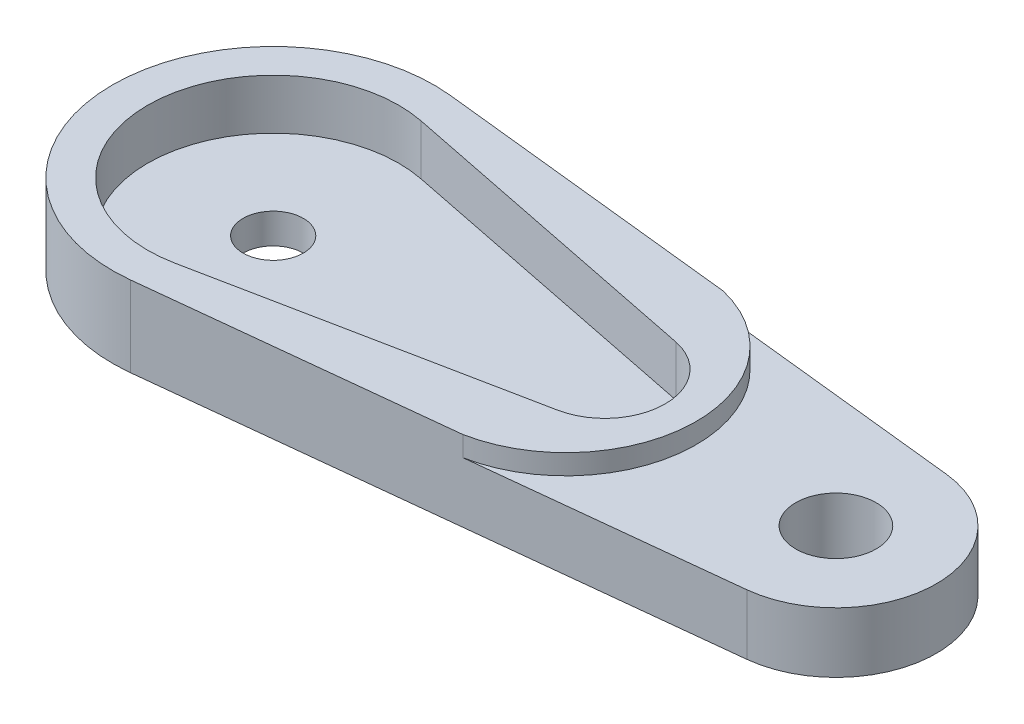
ISO-10303-21;
HEADER;
FILE_DESCRIPTION(('STEP AP214'),'2;1');
FILE_NAME('part.step','',(''),(''),'','','');
FILE_SCHEMA(('AUTOMOTIVE_DESIGN { 1 0 10303 214 1 1 1 1 }'));
ENDSEC;
DATA;
#1=APPLICATION_CONTEXT('core data for automotive mechanical design processes');
#2=APPLICATION_PROTOCOL_DEFINITION('international standard','automotive_design',2000,#1);
#3=PRODUCT_CONTEXT('',#1,'mechanical');
#4=PRODUCT('Part','Part','',(#3));
#5=PRODUCT_RELATED_PRODUCT_CATEGORY('part','',(#4));
#6=PRODUCT_DEFINITION_FORMATION('','',#4);
#7=PRODUCT_DEFINITION_CONTEXT('part definition',#1,'design');
#8=PRODUCT_DEFINITION('design','',#6,#7);
#9=PRODUCT_DEFINITION_SHAPE('','',#8);
#10=(LENGTH_UNIT() NAMED_UNIT(*) SI_UNIT(.MILLI.,.METRE.));
#11=(NAMED_UNIT(*) PLANE_ANGLE_UNIT() SI_UNIT($,.RADIAN.));
#12=(NAMED_UNIT(*) SI_UNIT($,.STERADIAN.) SOLID_ANGLE_UNIT());
#13=UNCERTAINTY_MEASURE_WITH_UNIT(LENGTH_MEASURE(1.E-05),#10,'distance_accuracy_value','');
#14=(GEOMETRIC_REPRESENTATION_CONTEXT(3) GLOBAL_UNCERTAINTY_ASSIGNED_CONTEXT((#13)) GLOBAL_UNIT_ASSIGNED_CONTEXT((#10,
#11,#12)) REPRESENTATION_CONTEXT('',''));
#15=CARTESIAN_POINT('',(0.,0.,0.));
#16=DIRECTION('',(0.,0.,1.));
#17=DIRECTION('',(1.,0.,0.));
#18=AXIS2_PLACEMENT_3D('',#15,#16,#17);
#19=CARTESIAN_POINT('',(28.,4.,0.));
#20=DIRECTION('',(0.,-1.,0.));
#21=DIRECTION('',(0.,0.,-1.));
#22=AXIS2_PLACEMENT_3D('',#19,#20,#21);
#23=CYLINDRICAL_SURFACE('',#22,5.);
#24=CARTESIAN_POINT('',(28.,3.,0.));
#25=DIRECTION('',(0.,1.,0.));
#26=DIRECTION('',(0.,0.,1.));
#27=AXIS2_PLACEMENT_3D('',#24,#25,#26);
#28=CIRCLE('',#27,5.);
#29=CARTESIAN_POINT('',(28.5357142857143,3.,4.97121818109824));
#30=VERTEX_POINT('',#29);
#31=CARTESIAN_POINT('',(28.5357142857143,3.,-4.97121818109824));
#32=VERTEX_POINT('',#31);
#33=EDGE_CURVE('E121',#30,#32,#28,.T.);
#34=ORIENTED_EDGE('',*,*,#33,.F.);
#35=DIRECTION('',(0.,-1.,0.));
#36=VECTOR('',#35,1.);
#37=CARTESIAN_POINT('',(28.5357142857143,4.,4.97121818109824));
#38=LINE('',#37,#36);
#39=CARTESIAN_POINT('',(28.5357142857143,0.,4.97121818109824));
#40=VERTEX_POINT('',#39);
#41=EDGE_CURVE('E175',#30,#40,#38,.T.);
#42=ORIENTED_EDGE('',*,*,#41,.T.);
#43=CARTESIAN_POINT('',(28.,0.,0.));
#44=DIRECTION('',(0.,1.,0.));
#45=DIRECTION('',(0.,0.,1.));
#46=AXIS2_PLACEMENT_3D('',#43,#44,#45);
#47=CIRCLE('',#46,5.);
#48=CARTESIAN_POINT('',(28.5357142857143,0.,-4.97121818109824));
#49=VERTEX_POINT('',#48);
#50=EDGE_CURVE('E162',#40,#49,#47,.T.);
#51=ORIENTED_EDGE('',*,*,#50,.T.);
#52=DIRECTION('',(0.,-1.,0.));
#53=VECTOR('',#52,1.);
#54=CARTESIAN_POINT('',(28.5357142857143,4.,-4.97121818109824));
#55=LINE('',#54,#53);
#56=EDGE_CURVE('E11',#32,#49,#55,.T.);
#57=ORIENTED_EDGE('',*,*,#56,.F.);
#58=EDGE_LOOP('',(#34,#42,#51,#57));
#59=FACE_BOUND('',#58,.T.);
#60=ADVANCED_FACE('F34',(#59),#23,.T.);
#61=CARTESIAN_POINT('',(28.,4.,0.));
#62=DIRECTION('',(0.,-1.,0.));
#63=DIRECTION('',(0.,0.,-1.));
#64=AXIS2_PLACEMENT_3D('',#61,#62,#63);
#65=CYLINDRICAL_SURFACE('',#64,2.);
#66=CARTESIAN_POINT('',(28.,0.,0.));
#67=DIRECTION('',(0.,1.,0.));
#68=DIRECTION('',(0.,0.,1.));
#69=AXIS2_PLACEMENT_3D('',#66,#67,#68);
#70=CIRCLE('',#69,2.);
#71=CARTESIAN_POINT('',(28.,0.,2.));
#72=VERTEX_POINT('',#71);
#73=EDGE_CURVE('E170',#72,#72,#70,.T.);
#74=ORIENTED_EDGE('',*,*,#73,.F.);
#75=EDGE_LOOP('',(#74));
#76=FACE_BOUND('',#75,.T.);
#77=CARTESIAN_POINT('',(28.,3.,0.));
#78=DIRECTION('',(0.,1.,0.));
#79=DIRECTION('',(0.,0.,1.));
#80=AXIS2_PLACEMENT_3D('',#77,#78,#79);
#81=CIRCLE('',#80,2.);
#82=CARTESIAN_POINT('',(28.,3.,2.));
#83=VERTEX_POINT('',#82);
#84=EDGE_CURVE('E124',#83,#83,#81,.F.);
#85=ORIENTED_EDGE('',*,*,#84,.F.);
#86=EDGE_LOOP('',(#85));
#87=FACE_BOUND('',#86,.T.);
#88=ADVANCED_FACE('F219',(#76,#87),#65,.F.);
#89=CARTESIAN_POINT('',(0.,4.,0.));
#90=DIRECTION('',(0.,1.,0.));
#91=DIRECTION('',(0.,0.,1.));
#92=AXIS2_PLACEMENT_3D('',#89,#90,#91);
#93=PLANE('',#92);
#94=CARTESIAN_POINT('',(16.5,4.,0.));
#95=DIRECTION('',(0.,1.,0.));
#96=DIRECTION('',(0.,0.,1.));
#97=AXIS2_PLACEMENT_3D('',#94,#95,#96);
#98=CIRCLE('',#97,2.99999999999999);
#99=CARTESIAN_POINT('',(17.0909090909091,4.,2.94122873069759));
#100=VERTEX_POINT('',#99);
#101=CARTESIAN_POINT('',(17.0909090909091,4.,-2.9412287306976));
#102=VERTEX_POINT('',#101);
#103=EDGE_CURVE('E56',#100,#102,#98,.T.);
#104=ORIENTED_EDGE('',*,*,#103,.F.);
#105=DIRECTION('',(0.980409576899199,0.,-0.196969696969697));
#106=VECTOR('',#105,1.);
#107=CARTESIAN_POINT('',(1.23106060606061,4.,6.12755985561999));
#108=LINE('',#107,#106);
#109=CARTESIAN_POINT('',(1.23106060606061,4.,6.12755985561999));
#110=VERTEX_POINT('',#109);
#111=EDGE_CURVE('E139',#110,#100,#108,.T.);
#112=ORIENTED_EDGE('',*,*,#111,.F.);
#113=CARTESIAN_POINT('',(0.,4.,0.));
#114=DIRECTION('',(0.,1.,0.));
#115=DIRECTION('',(0.,0.,1.));
#116=AXIS2_PLACEMENT_3D('',#113,#114,#115);
#117=CIRCLE('',#116,6.25);
#118=CARTESIAN_POINT('',(1.23106060606061,4.,-6.12755985561999));
#119=VERTEX_POINT('',#118);
#120=EDGE_CURVE('E155',#119,#110,#117,.T.);
#121=ORIENTED_EDGE('',*,*,#120,.F.);
#122=DIRECTION('',(0.980409576899199,0.,0.196969696969697));
#123=VECTOR('',#122,1.);
#124=CARTESIAN_POINT('',(1.23106060606061,4.,-6.12755985562));
#125=LINE('',#124,#123);
#126=EDGE_CURVE('E152',#119,#102,#125,.T.);
#127=ORIENTED_EDGE('',*,*,#126,.T.);
#128=EDGE_LOOP('',(#104,#112,#121,#127));
#129=FACE_BOUND('',#128,.T.);
#130=CARTESIAN_POINT('',(14.5493287651326,4.,-0.0158519430827212));
#131=DIRECTION('',(0.,1.,0.));
#132=DIRECTION('',(0.,0.,1.));
#133=AXIS2_PLACEMENT_3D('',#130,#131,#132);
#134=CIRCLE('',#133,6.48010539250112);
#135=CARTESIAN_POINT('',(16.0732962827988,4.,-6.31420799073677));
#136=VERTEX_POINT('',#135);
#137=CARTESIAN_POINT('',(15.785851253149,4.,6.34518398155658));
#138=VERTEX_POINT('',#137);
#139=EDGE_CURVE('E212',#136,#138,#134,.F.);
#140=ORIENTED_EDGE('',*,*,#139,.F.);
#141=DIRECTION('',(0.994243636219647,0.,0.107142857142857));
#142=VECTOR('',#141,1.);
#143=CARTESIAN_POINT('',(0.857142857142857,4.,-7.95394908975718));
#144=LINE('',#143,#142);
#145=CARTESIAN_POINT('',(0.857142857142857,4.,-7.95394908975718));
#146=VERTEX_POINT('',#145);
#147=EDGE_CURVE('E129',#146,#136,#144,.T.);
#148=ORIENTED_EDGE('',*,*,#147,.F.);
#149=CARTESIAN_POINT('',(0.,4.,0.));
#150=DIRECTION('',(0.,1.,0.));
#151=DIRECTION('',(0.,0.,1.));
#152=AXIS2_PLACEMENT_3D('',#149,#150,#151);
#153=CIRCLE('',#152,8.);
#154=CARTESIAN_POINT('',(0.857142857142857,4.,7.95394908975718));
#155=VERTEX_POINT('',#154);
#156=EDGE_CURVE('E169',#146,#155,#153,.T.);
#157=ORIENTED_EDGE('',*,*,#156,.T.);
#158=DIRECTION('',(0.994243636219647,0.,-0.107142857142857));
#159=VECTOR('',#158,1.);
#160=CARTESIAN_POINT('',(0.857142857142857,4.,7.95394908975718));
#161=LINE('',#160,#159);
#162=EDGE_CURVE('E172',#155,#138,#161,.T.);
#163=ORIENTED_EDGE('',*,*,#162,.T.);
#164=EDGE_LOOP('',(#140,#148,#157,#163));
#165=FACE_BOUND('',#164,.T.);
#166=ADVANCED_FACE('F211',(#129,#165),#93,.T.);
#167=CARTESIAN_POINT('',(0.,4.,0.));
#168=DIRECTION('',(0.,-1.,0.));
#169=DIRECTION('',(0.,0.,-1.));
#170=AXIS2_PLACEMENT_3D('',#167,#168,#169);
#171=CYLINDRICAL_SURFACE('',#170,1.5);
#172=CARTESIAN_POINT('',(0.,0.,0.));
#173=DIRECTION('',(0.,1.,0.));
#174=DIRECTION('',(0.,0.,1.));
#175=AXIS2_PLACEMENT_3D('',#172,#173,#174);
#176=CIRCLE('',#175,1.5);
#177=CARTESIAN_POINT('',(0.,0.,1.5));
#178=VERTEX_POINT('',#177);
#179=EDGE_CURVE('E186',#178,#178,#176,.T.);
#180=ORIENTED_EDGE('',*,*,#179,.F.);
#181=EDGE_LOOP('',(#180));
#182=FACE_BOUND('',#181,.T.);
#183=CARTESIAN_POINT('',(0.,1.5,0.));
#184=DIRECTION('',(0.,1.,0.));
#185=DIRECTION('',(0.,0.,1.));
#186=AXIS2_PLACEMENT_3D('',#183,#184,#185);
#187=CIRCLE('',#186,1.5);
#188=CARTESIAN_POINT('',(0.,1.5,1.5));
#189=VERTEX_POINT('',#188);
#190=EDGE_CURVE('E147',#189,#189,#187,.F.);
#191=ORIENTED_EDGE('',*,*,#190,.F.);
#192=EDGE_LOOP('',(#191));
#193=FACE_BOUND('',#192,.T.);
#194=ADVANCED_FACE('F227',(#182,#193),#171,.F.);
#195=CARTESIAN_POINT('',(0.857142857142857,4.,-7.95394908975718));
#196=DIRECTION('',(0.107142857142857,0.,-0.994243636219647));
#197=DIRECTION('',(-0.994243636219647,0.,-0.107142857142857));
#198=AXIS2_PLACEMENT_3D('',#195,#196,#197);
#199=PLANE('',#198);
#200=DIRECTION('',(0.,1.,0.));
#201=VECTOR('',#200,1.);
#202=CARTESIAN_POINT('',(16.0732962827988,3.,-6.31420799073677));
#203=LINE('',#202,#201);
#204=CARTESIAN_POINT('',(16.0732962827988,3.,-6.31420799073677));
#205=VERTEX_POINT('',#204);
#206=EDGE_CURVE('E48',#205,#136,#203,.T.);
#207=ORIENTED_EDGE('',*,*,#206,.F.);
#208=DIRECTION('',(-0.994243636219647,0.,-0.107142857142857));
#209=VECTOR('',#208,1.);
#210=CARTESIAN_POINT('',(0.857142857142857,3.,-7.95394908975718));
#211=LINE('',#210,#209);
#212=EDGE_CURVE('E116',#32,#205,#211,.T.);
#213=ORIENTED_EDGE('',*,*,#212,.F.);
#214=ORIENTED_EDGE('',*,*,#56,.T.);
#215=DIRECTION('',(0.994243636219647,0.,0.107142857142857));
#216=VECTOR('',#215,1.);
#217=CARTESIAN_POINT('',(0.857142857142857,0.,-7.95394908975718));
#218=LINE('',#217,#216);
#219=CARTESIAN_POINT('',(0.857142857142857,0.,-7.95394908975718));
#220=VERTEX_POINT('',#219);
#221=EDGE_CURVE('E178',#220,#49,#218,.T.);
#222=ORIENTED_EDGE('',*,*,#221,.F.);
#223=DIRECTION('',(0.,-1.,0.));
#224=VECTOR('',#223,1.);
#225=CARTESIAN_POINT('',(0.857142857142857,4.,-7.95394908975718));
#226=LINE('',#225,#224);
#227=EDGE_CURVE('E41',#146,#220,#226,.T.);
#228=ORIENTED_EDGE('',*,*,#227,.F.);
#229=ORIENTED_EDGE('',*,*,#147,.T.);
#230=EDGE_LOOP('',(#207,#213,#214,#222,#228,#229));
#231=FACE_BOUND('',#230,.T.);
#232=ADVANCED_FACE('F127',(#231),#199,.T.);
#233=CARTESIAN_POINT('',(0.,4.,0.));
#234=DIRECTION('',(0.,-1.,0.));
#235=DIRECTION('',(0.,0.,-1.));
#236=AXIS2_PLACEMENT_3D('',#233,#234,#235);
#237=CYLINDRICAL_SURFACE('',#236,8.);
#238=CARTESIAN_POINT('',(0.,0.,0.));
#239=DIRECTION('',(0.,1.,0.));
#240=DIRECTION('',(0.,0.,1.));
#241=AXIS2_PLACEMENT_3D('',#238,#239,#240);
#242=CIRCLE('',#241,8.);
#243=CARTESIAN_POINT('',(0.857142857142857,0.,7.95394908975718));
#244=VERTEX_POINT('',#243);
#245=EDGE_CURVE('E181',#220,#244,#242,.T.);
#246=ORIENTED_EDGE('',*,*,#245,.T.);
#247=DIRECTION('',(0.,-1.,0.));
#248=VECTOR('',#247,1.);
#249=CARTESIAN_POINT('',(0.857142857142857,4.,7.95394908975718));
#250=LINE('',#249,#248);
#251=EDGE_CURVE('E192',#155,#244,#250,.T.);
#252=ORIENTED_EDGE('',*,*,#251,.F.);
#253=ORIENTED_EDGE('',*,*,#156,.F.);
#254=ORIENTED_EDGE('',*,*,#227,.T.);
#255=EDGE_LOOP('',(#246,#252,#253,#254));
#256=FACE_BOUND('',#255,.T.);
#257=ADVANCED_FACE('F197',(#256),#237,.T.);
#258=CARTESIAN_POINT('',(0.857142857142857,4.,7.95394908975718));
#259=DIRECTION('',(-0.107142857142857,0.,-0.994243636219647));
#260=DIRECTION('',(-0.994243636219647,0.,0.107142857142857));
#261=AXIS2_PLACEMENT_3D('',#258,#259,#260);
#262=PLANE('',#261);
#263=DIRECTION('',(0.994243636219647,0.,-0.107142857142857));
#264=VECTOR('',#263,1.);
#265=CARTESIAN_POINT('',(0.857142857142857,3.,7.95394908975718));
#266=LINE('',#265,#264);
#267=CARTESIAN_POINT('',(15.785851253149,3.,6.34518398155658));
#268=VERTEX_POINT('',#267);
#269=EDGE_CURVE('E115',#268,#30,#266,.T.);
#270=ORIENTED_EDGE('',*,*,#269,.F.);
#271=DIRECTION('',(0.,1.,0.));
#272=VECTOR('',#271,1.);
#273=CARTESIAN_POINT('',(15.785851253149,3.,6.34518398155658));
#274=LINE('',#273,#272);
#275=EDGE_CURVE('E112',#268,#138,#274,.T.);
#276=ORIENTED_EDGE('',*,*,#275,.T.);
#277=ORIENTED_EDGE('',*,*,#162,.F.);
#278=ORIENTED_EDGE('',*,*,#251,.T.);
#279=DIRECTION('',(0.994243636219647,0.,-0.107142857142857));
#280=VECTOR('',#279,1.);
#281=CARTESIAN_POINT('',(0.857142857142857,0.,7.95394908975718));
#282=LINE('',#281,#280);
#283=EDGE_CURVE('E183',#244,#40,#282,.T.);
#284=ORIENTED_EDGE('',*,*,#283,.T.);
#285=ORIENTED_EDGE('',*,*,#41,.F.);
#286=EDGE_LOOP('',(#270,#276,#277,#278,#284,#285));
#287=FACE_BOUND('',#286,.T.);
#288=ADVANCED_FACE('F208',(#287),#262,.F.);
#289=CARTESIAN_POINT('',(0.,0.,0.));
#290=DIRECTION('',(0.,1.,0.));
#291=DIRECTION('',(0.,0.,1.));
#292=AXIS2_PLACEMENT_3D('',#289,#290,#291);
#293=PLANE('',#292);
#294=ORIENTED_EDGE('',*,*,#50,.F.);
#295=ORIENTED_EDGE('',*,*,#283,.F.);
#296=ORIENTED_EDGE('',*,*,#245,.F.);
#297=ORIENTED_EDGE('',*,*,#221,.T.);
#298=EDGE_LOOP('',(#294,#295,#296,#297));
#299=FACE_BOUND('',#298,.T.);
#300=ORIENTED_EDGE('',*,*,#179,.T.);
#301=EDGE_LOOP('',(#300));
#302=FACE_BOUND('',#301,.T.);
#303=ORIENTED_EDGE('',*,*,#73,.T.);
#304=EDGE_LOOP('',(#303));
#305=FACE_BOUND('',#304,.T.);
#306=ADVANCED_FACE('F203',(#299,#302,#305),#293,.F.);
#307=CARTESIAN_POINT('',(16.5,1.5,0.));
#308=DIRECTION('',(0.,1.,0.));
#309=DIRECTION('',(0.,0.,1.));
#310=AXIS2_PLACEMENT_3D('',#307,#308,#309);
#311=CYLINDRICAL_SURFACE('',#310,2.99999999999999);
#312=ORIENTED_EDGE('',*,*,#103,.T.);
#313=DIRECTION('',(0.,1.,0.));
#314=VECTOR('',#313,1.);
#315=CARTESIAN_POINT('',(17.0909090909091,1.5,-2.94122873069759));
#316=LINE('',#315,#314);
#317=CARTESIAN_POINT('',(17.0909090909091,1.5,-2.94122873069759));
#318=VERTEX_POINT('',#317);
#319=EDGE_CURVE('E150',#318,#102,#316,.T.);
#320=ORIENTED_EDGE('',*,*,#319,.F.);
#321=CARTESIAN_POINT('',(16.5,1.5,0.));
#322=DIRECTION('',(0.,1.,0.));
#323=DIRECTION('',(0.,0.,1.));
#324=AXIS2_PLACEMENT_3D('',#321,#322,#323);
#325=CIRCLE('',#324,2.99999999999999);
#326=CARTESIAN_POINT('',(17.0909090909091,1.5,2.94122873069759));
#327=VERTEX_POINT('',#326);
#328=EDGE_CURVE('E135',#327,#318,#325,.T.);
#329=ORIENTED_EDGE('',*,*,#328,.F.);
#330=DIRECTION('',(0.,1.,0.));
#331=VECTOR('',#330,1.);
#332=CARTESIAN_POINT('',(17.0909090909091,1.5,2.94122873069759));
#333=LINE('',#332,#331);
#334=EDGE_CURVE('E160',#327,#100,#333,.T.);
#335=ORIENTED_EDGE('',*,*,#334,.T.);
#336=EDGE_LOOP('',(#312,#320,#329,#335));
#337=FACE_BOUND('',#336,.T.);
#338=ADVANCED_FACE('F260',(#337),#311,.F.);
#339=CARTESIAN_POINT('',(1.23106060606061,1.5,6.12755985561999));
#340=DIRECTION('',(0.196969696969697,0.,0.980409576899199));
#341=DIRECTION('',(0.980409576899199,0.,-0.196969696969697));
#342=AXIS2_PLACEMENT_3D('',#339,#340,#341);
#343=PLANE('',#342);
#344=ORIENTED_EDGE('',*,*,#111,.T.);
#345=ORIENTED_EDGE('',*,*,#334,.F.);
#346=DIRECTION('',(0.980409576899199,0.,-0.196969696969697));
#347=VECTOR('',#346,1.);
#348=CARTESIAN_POINT('',(1.23106060606061,1.5,6.12755985561999));
#349=LINE('',#348,#347);
#350=CARTESIAN_POINT('',(1.23106060606061,1.5,6.12755985561999));
#351=VERTEX_POINT('',#350);
#352=EDGE_CURVE('E144',#351,#327,#349,.T.);
#353=ORIENTED_EDGE('',*,*,#352,.F.);
#354=DIRECTION('',(0.,1.,0.));
#355=VECTOR('',#354,1.);
#356=CARTESIAN_POINT('',(1.23106060606061,1.5,6.12755985561999));
#357=LINE('',#356,#355);
#358=EDGE_CURVE('E163',#351,#110,#357,.T.);
#359=ORIENTED_EDGE('',*,*,#358,.T.);
#360=EDGE_LOOP('',(#344,#345,#353,#359));
#361=FACE_BOUND('',#360,.T.);
#362=ADVANCED_FACE('F266',(#361),#343,.F.);
#363=CARTESIAN_POINT('',(0.,1.5,0.));
#364=DIRECTION('',(0.,1.,0.));
#365=DIRECTION('',(0.,0.,1.));
#366=AXIS2_PLACEMENT_3D('',#363,#364,#365);
#367=CYLINDRICAL_SURFACE('',#366,6.25);
#368=ORIENTED_EDGE('',*,*,#120,.T.);
#369=ORIENTED_EDGE('',*,*,#358,.F.);
#370=CARTESIAN_POINT('',(0.,1.5,0.));
#371=DIRECTION('',(0.,1.,0.));
#372=DIRECTION('',(0.,0.,1.));
#373=AXIS2_PLACEMENT_3D('',#370,#371,#372);
#374=CIRCLE('',#373,6.25);
#375=CARTESIAN_POINT('',(1.23106060606061,1.5,-6.12755985561999));
#376=VERTEX_POINT('',#375);
#377=EDGE_CURVE('E141',#376,#351,#374,.T.);
#378=ORIENTED_EDGE('',*,*,#377,.F.);
#379=DIRECTION('',(0.,1.,0.));
#380=VECTOR('',#379,1.);
#381=CARTESIAN_POINT('',(1.23106060606061,1.5,-6.12755985561999));
#382=LINE('',#381,#380);
#383=EDGE_CURVE('E165',#376,#119,#382,.T.);
#384=ORIENTED_EDGE('',*,*,#383,.T.);
#385=EDGE_LOOP('',(#368,#369,#378,#384));
#386=FACE_BOUND('',#385,.T.);
#387=ADVANCED_FACE('F273',(#386),#367,.F.);
#388=CARTESIAN_POINT('',(1.23106060606061,1.5,-6.12755985562));
#389=DIRECTION('',(-0.196969696969697,0.,0.980409576899199));
#390=DIRECTION('',(0.980409576899199,0.,0.196969696969697));
#391=AXIS2_PLACEMENT_3D('',#388,#389,#390);
#392=PLANE('',#391);
#393=ORIENTED_EDGE('',*,*,#126,.F.);
#394=ORIENTED_EDGE('',*,*,#383,.F.);
#395=DIRECTION('',(0.980409576899199,0.,0.196969696969697));
#396=VECTOR('',#395,1.);
#397=CARTESIAN_POINT('',(1.23106060606061,1.5,-6.12755985562));
#398=LINE('',#397,#396);
#399=EDGE_CURVE('E138',#376,#318,#398,.T.);
#400=ORIENTED_EDGE('',*,*,#399,.T.);
#401=ORIENTED_EDGE('',*,*,#319,.T.);
#402=EDGE_LOOP('',(#393,#394,#400,#401));
#403=FACE_BOUND('',#402,.T.);
#404=ADVANCED_FACE('F281',(#403),#392,.T.);
#405=CARTESIAN_POINT('',(0.,1.5,0.));
#406=DIRECTION('',(0.,1.,0.));
#407=DIRECTION('',(0.,0.,1.));
#408=AXIS2_PLACEMENT_3D('',#405,#406,#407);
#409=PLANE('',#408);
#410=ORIENTED_EDGE('',*,*,#328,.T.);
#411=ORIENTED_EDGE('',*,*,#399,.F.);
#412=ORIENTED_EDGE('',*,*,#377,.T.);
#413=ORIENTED_EDGE('',*,*,#352,.T.);
#414=EDGE_LOOP('',(#410,#411,#412,#413));
#415=FACE_BOUND('',#414,.T.);
#416=ORIENTED_EDGE('',*,*,#190,.T.);
#417=EDGE_LOOP('',(#416));
#418=FACE_BOUND('',#417,.T.);
#419=ADVANCED_FACE('F289',(#415,#418),#409,.T.);
#420=CARTESIAN_POINT('',(14.5493287651326,3.,-0.0158519430827212));
#421=DIRECTION('',(0.,1.,0.));
#422=DIRECTION('',(0.,0.,1.));
#423=AXIS2_PLACEMENT_3D('',#420,#421,#422);
#424=CYLINDRICAL_SURFACE('',#423,6.48010539250112);
#425=ORIENTED_EDGE('',*,*,#139,.T.);
#426=ORIENTED_EDGE('',*,*,#275,.F.);
#427=CARTESIAN_POINT('',(14.5493287651326,3.,-0.0158519430827212));
#428=DIRECTION('',(0.,1.,0.));
#429=DIRECTION('',(0.,0.,1.));
#430=AXIS2_PLACEMENT_3D('',#427,#428,#429);
#431=CIRCLE('',#430,6.48010539250112);
#432=EDGE_CURVE('E108',#205,#268,#431,.F.);
#433=ORIENTED_EDGE('',*,*,#432,.F.);
#434=ORIENTED_EDGE('',*,*,#206,.T.);
#435=EDGE_LOOP('',(#425,#426,#433,#434));
#436=FACE_BOUND('',#435,.T.);
#437=ADVANCED_FACE('F110',(#436),#424,.T.);
#438=CARTESIAN_POINT('',(0.,3.,0.));
#439=DIRECTION('',(0.,1.,0.));
#440=DIRECTION('',(0.,0.,1.));
#441=AXIS2_PLACEMENT_3D('',#438,#439,#440);
#442=PLANE('',#441);
#443=ORIENTED_EDGE('',*,*,#84,.T.);
#444=EDGE_LOOP('',(#443));
#445=FACE_BOUND('',#444,.T.);
#446=ORIENTED_EDGE('',*,*,#212,.T.);
#447=ORIENTED_EDGE('',*,*,#432,.T.);
#448=ORIENTED_EDGE('',*,*,#269,.T.);
#449=ORIENTED_EDGE('',*,*,#33,.T.);
#450=EDGE_LOOP('',(#446,#447,#448,#449));
#451=FACE_BOUND('',#450,.T.);
#452=ADVANCED_FACE('F119',(#445,#451),#442,.T.);
#453=CLOSED_SHELL('',(#60,#88,#166,#194,#232,#257,#288,#306,#338,#362,#387,#404,#419,#437,#452));
#454=MANIFOLD_SOLID_BREP('B2',#453);
#455=ADVANCED_BREP_SHAPE_REPRESENTATION('',(#18,#454),#14);
#456=SHAPE_DEFINITION_REPRESENTATION(#9,#455);
ENDSEC;
END-ISO-10303-21;
